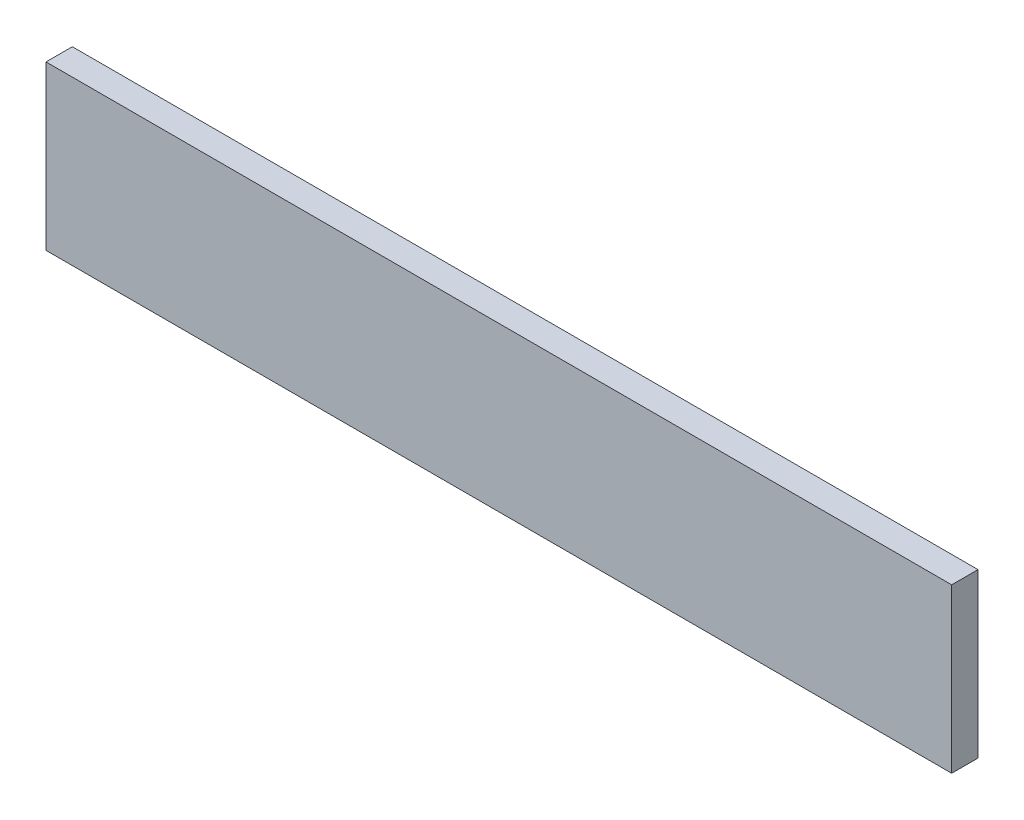
ISO-10303-21;
HEADER;
FILE_DESCRIPTION(('STEP AP214'),'2;1');
FILE_NAME('part.step','',(''),(''),'','','');
FILE_SCHEMA(('AUTOMOTIVE_DESIGN { 1 0 10303 214 1 1 1 1 }'));
ENDSEC;
DATA;
#1=APPLICATION_CONTEXT('core data for automotive mechanical design processes');
#2=APPLICATION_PROTOCOL_DEFINITION('international standard','automotive_design',2000,#1);
#3=PRODUCT_CONTEXT('',#1,'mechanical');
#4=PRODUCT('Part','Part','',(#3));
#5=PRODUCT_RELATED_PRODUCT_CATEGORY('part','',(#4));
#6=PRODUCT_DEFINITION_FORMATION('','',#4);
#7=PRODUCT_DEFINITION_CONTEXT('part definition',#1,'design');
#8=PRODUCT_DEFINITION('design','',#6,#7);
#9=PRODUCT_DEFINITION_SHAPE('','',#8);
#10=(LENGTH_UNIT() NAMED_UNIT(*) SI_UNIT(.MILLI.,.METRE.));
#11=(NAMED_UNIT(*) PLANE_ANGLE_UNIT() SI_UNIT($,.RADIAN.));
#12=(NAMED_UNIT(*) SI_UNIT($,.STERADIAN.) SOLID_ANGLE_UNIT());
#13=UNCERTAINTY_MEASURE_WITH_UNIT(LENGTH_MEASURE(1.E-05),#10,'distance_accuracy_value','');
#14=(GEOMETRIC_REPRESENTATION_CONTEXT(3) GLOBAL_UNCERTAINTY_ASSIGNED_CONTEXT((#13)) GLOBAL_UNIT_ASSIGNED_CONTEXT((#10,
#11,#12)) REPRESENTATION_CONTEXT('',''));
#15=CARTESIAN_POINT('',(0.,0.,0.));
#16=DIRECTION('',(0.,0.,1.));
#17=DIRECTION('',(1.,0.,0.));
#18=AXIS2_PLACEMENT_3D('',#15,#16,#17);
#19=CARTESIAN_POINT('',(0.,0.,25.));
#20=DIRECTION('',(1.,0.,0.));
#21=DIRECTION('',(0.,0.,-1.));
#22=AXIS2_PLACEMENT_3D('',#19,#20,#21);
#23=PLANE('',#22);
#24=DIRECTION('',(0.,-1.,0.));
#25=VECTOR('',#24,1.);
#26=CARTESIAN_POINT('',(0.,0.,0.));
#27=LINE('',#26,#25);
#28=CARTESIAN_POINT('',(0.,155.,0.));
#29=VERTEX_POINT('',#28);
#30=CARTESIAN_POINT('',(0.,0.,0.));
#31=VERTEX_POINT('',#30);
#32=EDGE_CURVE('E95',#29,#31,#27,.T.);
#33=ORIENTED_EDGE('',*,*,#32,.T.);
#34=DIRECTION('',(0.,0.,-1.));
#35=VECTOR('',#34,1.);
#36=CARTESIAN_POINT('',(0.,0.,25.));
#37=LINE('',#36,#35);
#38=CARTESIAN_POINT('',(0.,0.,25.));
#39=VERTEX_POINT('',#38);
#40=EDGE_CURVE('E11',#39,#31,#37,.T.);
#41=ORIENTED_EDGE('',*,*,#40,.F.);
#42=DIRECTION('',(0.,-1.,0.));
#43=VECTOR('',#42,1.);
#44=CARTESIAN_POINT('',(0.,0.,25.));
#45=LINE('',#44,#43);
#46=CARTESIAN_POINT('',(0.,155.,25.));
#47=VERTEX_POINT('',#46);
#48=EDGE_CURVE('E83',#47,#39,#45,.T.);
#49=ORIENTED_EDGE('',*,*,#48,.F.);
#50=DIRECTION('',(0.,0.,-1.));
#51=VECTOR('',#50,1.);
#52=CARTESIAN_POINT('',(0.,155.,25.));
#53=LINE('',#52,#51);
#54=EDGE_CURVE('E91',#47,#29,#53,.T.);
#55=ORIENTED_EDGE('',*,*,#54,.T.);
#56=EDGE_LOOP('',(#33,#41,#49,#55));
#57=FACE_BOUND('',#56,.T.);
#58=ADVANCED_FACE('F32',(#57),#23,.F.);
#59=CARTESIAN_POINT('',(0.,0.,25.));
#60=DIRECTION('',(0.,1.,0.));
#61=DIRECTION('',(0.,0.,1.));
#62=AXIS2_PLACEMENT_3D('',#59,#60,#61);
#63=PLANE('',#62);
#64=DIRECTION('',(1.,0.,0.));
#65=VECTOR('',#64,1.);
#66=CARTESIAN_POINT('',(0.,0.,0.));
#67=LINE('',#66,#65);
#68=CARTESIAN_POINT('',(860.,0.,0.));
#69=VERTEX_POINT('',#68);
#70=EDGE_CURVE('E87',#31,#69,#67,.T.);
#71=ORIENTED_EDGE('',*,*,#70,.T.);
#72=DIRECTION('',(0.,0.,-1.));
#73=VECTOR('',#72,1.);
#74=CARTESIAN_POINT('',(860.,0.,25.));
#75=LINE('',#74,#73);
#76=CARTESIAN_POINT('',(860.,0.,25.));
#77=VERTEX_POINT('',#76);
#78=EDGE_CURVE('E40',#77,#69,#75,.T.);
#79=ORIENTED_EDGE('',*,*,#78,.F.);
#80=DIRECTION('',(1.,0.,0.));
#81=VECTOR('',#80,1.);
#82=CARTESIAN_POINT('',(0.,0.,25.));
#83=LINE('',#82,#81);
#84=EDGE_CURVE('E78',#39,#77,#83,.T.);
#85=ORIENTED_EDGE('',*,*,#84,.F.);
#86=ORIENTED_EDGE('',*,*,#40,.T.);
#87=EDGE_LOOP('',(#71,#79,#85,#86));
#88=FACE_BOUND('',#87,.T.);
#89=ADVANCED_FACE('F86',(#88),#63,.F.);
#90=CARTESIAN_POINT('',(860.,0.,25.));
#91=DIRECTION('',(-1.,0.,0.));
#92=DIRECTION('',(0.,0.,1.));
#93=AXIS2_PLACEMENT_3D('',#90,#91,#92);
#94=PLANE('',#93);
#95=DIRECTION('',(0.,1.,0.));
#96=VECTOR('',#95,1.);
#97=CARTESIAN_POINT('',(860.,0.,0.));
#98=LINE('',#97,#96);
#99=CARTESIAN_POINT('',(860.,155.,0.));
#100=VERTEX_POINT('',#99);
#101=EDGE_CURVE('E65',#69,#100,#98,.T.);
#102=ORIENTED_EDGE('',*,*,#101,.T.);
#103=DIRECTION('',(0.,0.,-1.));
#104=VECTOR('',#103,1.);
#105=CARTESIAN_POINT('',(860.,155.,25.));
#106=LINE('',#105,#104);
#107=CARTESIAN_POINT('',(860.,155.,25.));
#108=VERTEX_POINT('',#107);
#109=EDGE_CURVE('E88',#108,#100,#106,.T.);
#110=ORIENTED_EDGE('',*,*,#109,.F.);
#111=DIRECTION('',(0.,1.,0.));
#112=VECTOR('',#111,1.);
#113=CARTESIAN_POINT('',(860.,0.,25.));
#114=LINE('',#113,#112);
#115=EDGE_CURVE('E81',#77,#108,#114,.T.);
#116=ORIENTED_EDGE('',*,*,#115,.F.);
#117=ORIENTED_EDGE('',*,*,#78,.T.);
#118=EDGE_LOOP('',(#102,#110,#116,#117));
#119=FACE_BOUND('',#118,.T.);
#120=ADVANCED_FACE('F89',(#119),#94,.F.);
#121=CARTESIAN_POINT('',(0.,155.,25.));
#122=DIRECTION('',(0.,-1.,0.));
#123=DIRECTION('',(0.,0.,-1.));
#124=AXIS2_PLACEMENT_3D('',#121,#122,#123);
#125=PLANE('',#124);
#126=DIRECTION('',(-1.,0.,0.));
#127=VECTOR('',#126,1.);
#128=CARTESIAN_POINT('',(0.,155.,0.));
#129=LINE('',#128,#127);
#130=EDGE_CURVE('E71',#100,#29,#129,.T.);
#131=ORIENTED_EDGE('',*,*,#130,.T.);
#132=ORIENTED_EDGE('',*,*,#54,.F.);
#133=DIRECTION('',(-1.,0.,0.));
#134=VECTOR('',#133,1.);
#135=CARTESIAN_POINT('',(0.,155.,25.));
#136=LINE('',#135,#134);
#137=EDGE_CURVE('E48',#108,#47,#136,.T.);
#138=ORIENTED_EDGE('',*,*,#137,.F.);
#139=ORIENTED_EDGE('',*,*,#109,.T.);
#140=EDGE_LOOP('',(#131,#132,#138,#139));
#141=FACE_BOUND('',#140,.T.);
#142=ADVANCED_FACE('F102',(#141),#125,.F.);
#143=CARTESIAN_POINT('',(0.,0.,25.));
#144=DIRECTION('',(0.,0.,-1.));
#145=DIRECTION('',(-1.,0.,0.));
#146=AXIS2_PLACEMENT_3D('',#143,#144,#145);
#147=PLANE('',#146);
#148=ORIENTED_EDGE('',*,*,#48,.T.);
#149=ORIENTED_EDGE('',*,*,#84,.T.);
#150=ORIENTED_EDGE('',*,*,#115,.T.);
#151=ORIENTED_EDGE('',*,*,#137,.T.);
#152=EDGE_LOOP('',(#148,#149,#150,#151));
#153=FACE_BOUND('',#152,.T.);
#154=ADVANCED_FACE('F79',(#153),#147,.F.);
#155=CARTESIAN_POINT('',(0.,0.,0.));
#156=DIRECTION('',(0.,0.,-1.));
#157=DIRECTION('',(-1.,0.,0.));
#158=AXIS2_PLACEMENT_3D('',#155,#156,#157);
#159=PLANE('',#158);
#160=ORIENTED_EDGE('',*,*,#32,.F.);
#161=ORIENTED_EDGE('',*,*,#130,.F.);
#162=ORIENTED_EDGE('',*,*,#101,.F.);
#163=ORIENTED_EDGE('',*,*,#70,.F.);
#164=EDGE_LOOP('',(#160,#161,#162,#163));
#165=FACE_BOUND('',#164,.T.);
#166=ADVANCED_FACE('F105',(#165),#159,.T.);
#167=CLOSED_SHELL('',(#58,#89,#120,#142,#154,#166));
#168=MANIFOLD_SOLID_BREP('B2',#167);
#169=ADVANCED_BREP_SHAPE_REPRESENTATION('',(#18,#168),#14);
#170=SHAPE_DEFINITION_REPRESENTATION(#9,#169);
ENDSEC;
END-ISO-10303-21;
